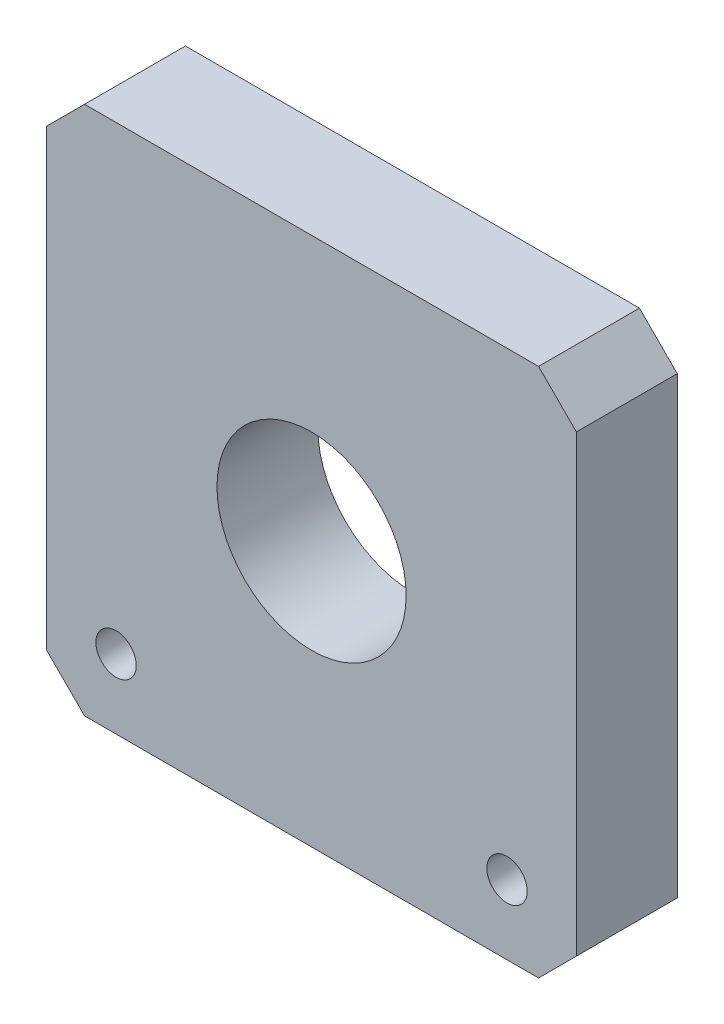
ISO-10303-21;
HEADER;
FILE_DESCRIPTION(('STEP AP214'),'2;1');
FILE_NAME('part.step','',(''),(''),'','','');
FILE_SCHEMA(('AUTOMOTIVE_DESIGN { 1 0 10303 214 1 1 1 1 }'));
ENDSEC;
DATA;
#1=APPLICATION_CONTEXT('core data for automotive mechanical design processes');
#2=APPLICATION_PROTOCOL_DEFINITION('international standard','automotive_design',2000,#1);
#3=PRODUCT_CONTEXT('',#1,'mechanical');
#4=PRODUCT('Part','Part','',(#3));
#5=PRODUCT_RELATED_PRODUCT_CATEGORY('part','',(#4));
#6=PRODUCT_DEFINITION_FORMATION('','',#4);
#7=PRODUCT_DEFINITION_CONTEXT('part definition',#1,'design');
#8=PRODUCT_DEFINITION('design','',#6,#7);
#9=PRODUCT_DEFINITION_SHAPE('','',#8);
#10=(LENGTH_UNIT() NAMED_UNIT(*) SI_UNIT(.MILLI.,.METRE.));
#11=(NAMED_UNIT(*) PLANE_ANGLE_UNIT() SI_UNIT($,.RADIAN.));
#12=(NAMED_UNIT(*) SI_UNIT($,.STERADIAN.) SOLID_ANGLE_UNIT());
#13=UNCERTAINTY_MEASURE_WITH_UNIT(LENGTH_MEASURE(1.E-05),#10,'distance_accuracy_value','');
#14=(GEOMETRIC_REPRESENTATION_CONTEXT(3) GLOBAL_UNCERTAINTY_ASSIGNED_CONTEXT((#13)) GLOBAL_UNIT_ASSIGNED_CONTEXT((#10,
#11,#12)) REPRESENTATION_CONTEXT('',''));
#15=CARTESIAN_POINT('',(0.,0.,0.));
#16=DIRECTION('',(0.,0.,1.));
#17=DIRECTION('',(1.,0.,0.));
#18=AXIS2_PLACEMENT_3D('',#15,#16,#17);
#19=CARTESIAN_POINT('',(0.,0.,8.));
#20=DIRECTION('',(1.,0.,0.));
#21=DIRECTION('',(0.,0.,-1.));
#22=AXIS2_PLACEMENT_3D('',#19,#20,#21);
#23=PLANE('',#22);
#24=DIRECTION('',(0.,-1.,0.));
#25=VECTOR('',#24,1.);
#26=CARTESIAN_POINT('',(0.,0.,0.));
#27=LINE('',#26,#25);
#28=CARTESIAN_POINT('',(0.,39.,0.));
#29=VERTEX_POINT('',#28);
#30=CARTESIAN_POINT('',(0.,3.00000000000002,0.));
#31=VERTEX_POINT('',#30);
#32=EDGE_CURVE('E133',#29,#31,#27,.T.);
#33=ORIENTED_EDGE('',*,*,#32,.T.);
#34=DIRECTION('',(0.,0.,1.));
#35=VECTOR('',#34,1.);
#36=CARTESIAN_POINT('',(0.,3.00000000000002,8.));
#37=LINE('',#36,#35);
#38=CARTESIAN_POINT('',(0.,3.00000000000002,8.));
#39=VERTEX_POINT('',#38);
#40=EDGE_CURVE('E165',#31,#39,#37,.T.);
#41=ORIENTED_EDGE('',*,*,#40,.T.);
#42=DIRECTION('',(0.,-1.,0.));
#43=VECTOR('',#42,1.);
#44=CARTESIAN_POINT('',(0.,0.,8.));
#45=LINE('',#44,#43);
#46=CARTESIAN_POINT('',(0.,39.,8.));
#47=VERTEX_POINT('',#46);
#48=EDGE_CURVE('E131',#47,#39,#45,.T.);
#49=ORIENTED_EDGE('',*,*,#48,.F.);
#50=DIRECTION('',(0.,0.,-1.));
#51=VECTOR('',#50,1.);
#52=CARTESIAN_POINT('',(0.,39.,8.));
#53=LINE('',#52,#51);
#54=EDGE_CURVE('E162',#47,#29,#53,.T.);
#55=ORIENTED_EDGE('',*,*,#54,.T.);
#56=EDGE_LOOP('',(#33,#41,#49,#55));
#57=FACE_BOUND('',#56,.T.);
#58=ADVANCED_FACE('F36',(#57),#23,.F.);
#59=CARTESIAN_POINT('',(0.,0.,8.));
#60=DIRECTION('',(0.,1.,0.));
#61=DIRECTION('',(0.,0.,1.));
#62=AXIS2_PLACEMENT_3D('',#59,#60,#61);
#63=PLANE('',#62);
#64=DIRECTION('',(1.,0.,0.));
#65=VECTOR('',#64,1.);
#66=CARTESIAN_POINT('',(0.,0.,0.));
#67=LINE('',#66,#65);
#68=CARTESIAN_POINT('',(3.,0.,0.));
#69=VERTEX_POINT('',#68);
#70=CARTESIAN_POINT('',(39.,0.,0.));
#71=VERTEX_POINT('',#70);
#72=EDGE_CURVE('E129',#69,#71,#67,.T.);
#73=ORIENTED_EDGE('',*,*,#72,.T.);
#74=DIRECTION('',(0.,0.,1.));
#75=VECTOR('',#74,1.);
#76=CARTESIAN_POINT('',(39.,0.,8.));
#77=LINE('',#76,#75);
#78=CARTESIAN_POINT('',(39.,0.,8.));
#79=VERTEX_POINT('',#78);
#80=EDGE_CURVE('E107',#71,#79,#77,.T.);
#81=ORIENTED_EDGE('',*,*,#80,.T.);
#82=DIRECTION('',(1.,0.,0.));
#83=VECTOR('',#82,1.);
#84=CARTESIAN_POINT('',(0.,0.,8.));
#85=LINE('',#84,#83);
#86=CARTESIAN_POINT('',(3.,0.,8.));
#87=VERTEX_POINT('',#86);
#88=EDGE_CURVE('E179',#87,#79,#85,.T.);
#89=ORIENTED_EDGE('',*,*,#88,.F.);
#90=DIRECTION('',(0.,0.,-1.));
#91=VECTOR('',#90,1.);
#92=CARTESIAN_POINT('',(3.,0.,8.));
#93=LINE('',#92,#91);
#94=EDGE_CURVE('E112',#87,#69,#93,.T.);
#95=ORIENTED_EDGE('',*,*,#94,.T.);
#96=EDGE_LOOP('',(#73,#81,#89,#95));
#97=FACE_BOUND('',#96,.T.);
#98=ADVANCED_FACE('F184',(#97),#63,.F.);
#99=CARTESIAN_POINT('',(42.,0.,8.));
#100=DIRECTION('',(-1.,0.,0.));
#101=DIRECTION('',(0.,0.,1.));
#102=AXIS2_PLACEMENT_3D('',#99,#100,#101);
#103=PLANE('',#102);
#104=DIRECTION('',(0.,1.,0.));
#105=VECTOR('',#104,1.);
#106=CARTESIAN_POINT('',(42.,0.,8.));
#107=LINE('',#106,#105);
#108=CARTESIAN_POINT('',(42.,3.,8.));
#109=VERTEX_POINT('',#108);
#110=CARTESIAN_POINT('',(42.,39.,8.));
#111=VERTEX_POINT('',#110);
#112=EDGE_CURVE('E121',#109,#111,#107,.T.);
#113=ORIENTED_EDGE('',*,*,#112,.F.);
#114=DIRECTION('',(0.,0.,-1.));
#115=VECTOR('',#114,1.);
#116=CARTESIAN_POINT('',(42.,3.,8.));
#117=LINE('',#116,#115);
#118=CARTESIAN_POINT('',(42.,3.,0.));
#119=VERTEX_POINT('',#118);
#120=EDGE_CURVE('E106',#109,#119,#117,.T.);
#121=ORIENTED_EDGE('',*,*,#120,.T.);
#122=DIRECTION('',(0.,1.,0.));
#123=VECTOR('',#122,1.);
#124=CARTESIAN_POINT('',(42.,0.,0.));
#125=LINE('',#124,#123);
#126=CARTESIAN_POINT('',(42.,39.,0.));
#127=VERTEX_POINT('',#126);
#128=EDGE_CURVE('E119',#119,#127,#125,.T.);
#129=ORIENTED_EDGE('',*,*,#128,.T.);
#130=DIRECTION('',(0.,0.,1.));
#131=VECTOR('',#130,1.);
#132=CARTESIAN_POINT('',(42.,39.,8.));
#133=LINE('',#132,#131);
#134=EDGE_CURVE('E123',#127,#111,#133,.T.);
#135=ORIENTED_EDGE('',*,*,#134,.T.);
#136=EDGE_LOOP('',(#113,#121,#129,#135));
#137=FACE_BOUND('',#136,.T.);
#138=ADVANCED_FACE('F118',(#137),#103,.F.);
#139=CARTESIAN_POINT('',(0.,42.,8.));
#140=DIRECTION('',(0.,-1.,0.));
#141=DIRECTION('',(0.,0.,-1.));
#142=AXIS2_PLACEMENT_3D('',#139,#140,#141);
#143=PLANE('',#142);
#144=DIRECTION('',(-1.,0.,0.));
#145=VECTOR('',#144,1.);
#146=CARTESIAN_POINT('',(0.,42.,8.));
#147=LINE('',#146,#145);
#148=CARTESIAN_POINT('',(39.,42.,8.));
#149=VERTEX_POINT('',#148);
#150=CARTESIAN_POINT('',(3.00000000000002,42.,8.));
#151=VERTEX_POINT('',#150);
#152=EDGE_CURVE('E147',#149,#151,#147,.T.);
#153=ORIENTED_EDGE('',*,*,#152,.F.);
#154=DIRECTION('',(0.,0.,-1.));
#155=VECTOR('',#154,1.);
#156=CARTESIAN_POINT('',(39.,42.,8.));
#157=LINE('',#156,#155);
#158=CARTESIAN_POINT('',(39.,42.,0.));
#159=VERTEX_POINT('',#158);
#160=EDGE_CURVE('E11',#149,#159,#157,.T.);
#161=ORIENTED_EDGE('',*,*,#160,.T.);
#162=DIRECTION('',(-1.,0.,0.));
#163=VECTOR('',#162,1.);
#164=CARTESIAN_POINT('',(0.,42.,0.));
#165=LINE('',#164,#163);
#166=CARTESIAN_POINT('',(3.00000000000002,42.,0.));
#167=VERTEX_POINT('',#166);
#168=EDGE_CURVE('E128',#159,#167,#165,.T.);
#169=ORIENTED_EDGE('',*,*,#168,.T.);
#170=DIRECTION('',(0.,0.,1.));
#171=VECTOR('',#170,1.);
#172=CARTESIAN_POINT('',(3.00000000000002,42.,8.));
#173=LINE('',#172,#171);
#174=EDGE_CURVE('E44',#167,#151,#173,.T.);
#175=ORIENTED_EDGE('',*,*,#174,.T.);
#176=EDGE_LOOP('',(#153,#161,#169,#175));
#177=FACE_BOUND('',#176,.T.);
#178=ADVANCED_FACE('F202',(#177),#143,.F.);
#179=CARTESIAN_POINT('',(0.,0.,8.));
#180=DIRECTION('',(0.,0.,-1.));
#181=DIRECTION('',(-1.,0.,0.));
#182=AXIS2_PLACEMENT_3D('',#179,#180,#181);
#183=PLANE('',#182);
#184=CARTESIAN_POINT('',(36.5,5.5,8.));
#185=DIRECTION('',(0.,0.,1.));
#186=DIRECTION('',(1.,0.,0.));
#187=AXIS2_PLACEMENT_3D('',#184,#185,#186);
#188=CIRCLE('',#187,1.6);
#189=CARTESIAN_POINT('',(38.1,5.5,8.));
#190=VERTEX_POINT('',#189);
#191=EDGE_CURVE('E141',#190,#190,#188,.T.);
#192=ORIENTED_EDGE('',*,*,#191,.F.);
#193=EDGE_LOOP('',(#192));
#194=FACE_BOUND('',#193,.T.);
#195=CARTESIAN_POINT('',(5.50000000000001,5.5,8.));
#196=DIRECTION('',(0.,0.,1.));
#197=DIRECTION('',(1.,0.,0.));
#198=AXIS2_PLACEMENT_3D('',#195,#196,#197);
#199=CIRCLE('',#198,1.6);
#200=CARTESIAN_POINT('',(7.1,5.5,8.));
#201=VERTEX_POINT('',#200);
#202=EDGE_CURVE('E192',#201,#201,#199,.T.);
#203=ORIENTED_EDGE('',*,*,#202,.F.);
#204=EDGE_LOOP('',(#203));
#205=FACE_BOUND('',#204,.T.);
#206=CARTESIAN_POINT('',(21.,21.,8.));
#207=DIRECTION('',(0.,0.,1.));
#208=DIRECTION('',(1.,0.,0.));
#209=AXIS2_PLACEMENT_3D('',#206,#207,#208);
#210=CIRCLE('',#209,7.5);
#211=CARTESIAN_POINT('',(28.5,21.,8.));
#212=VERTEX_POINT('',#211);
#213=EDGE_CURVE('E189',#212,#212,#210,.T.);
#214=ORIENTED_EDGE('',*,*,#213,.F.);
#215=EDGE_LOOP('',(#214));
#216=FACE_BOUND('',#215,.T.);
#217=ORIENTED_EDGE('',*,*,#88,.T.);
#218=DIRECTION('',(-0.707106781186549,-0.707106781186546,0.));
#219=VECTOR('',#218,1.);
#220=CARTESIAN_POINT('',(42.,3.,8.));
#221=LINE('',#220,#219);
#222=EDGE_CURVE('E160',#79,#109,#221,.F.);
#223=ORIENTED_EDGE('',*,*,#222,.T.);
#224=ORIENTED_EDGE('',*,*,#112,.T.);
#225=DIRECTION('',(0.707106781186546,-0.707106781186549,0.));
#226=VECTOR('',#225,1.);
#227=CARTESIAN_POINT('',(39.,42.,8.));
#228=LINE('',#227,#226);
#229=EDGE_CURVE('E57',#111,#149,#228,.F.);
#230=ORIENTED_EDGE('',*,*,#229,.T.);
#231=ORIENTED_EDGE('',*,*,#152,.T.);
#232=DIRECTION('',(0.707106781186549,0.707106781186546,0.));
#233=VECTOR('',#232,1.);
#234=CARTESIAN_POINT('',(0.,39.,8.));
#235=LINE('',#234,#233);
#236=EDGE_CURVE('E155',#151,#47,#235,.F.);
#237=ORIENTED_EDGE('',*,*,#236,.T.);
#238=ORIENTED_EDGE('',*,*,#48,.T.);
#239=DIRECTION('',(-0.707106781186546,0.707106781186549,0.));
#240=VECTOR('',#239,1.);
#241=CARTESIAN_POINT('',(3.,0.,8.));
#242=LINE('',#241,#240);
#243=EDGE_CURVE('E158',#39,#87,#242,.F.);
#244=ORIENTED_EDGE('',*,*,#243,.T.);
#245=EDGE_LOOP('',(#217,#223,#224,#230,#231,#237,#238,#244));
#246=FACE_BOUND('',#245,.T.);
#247=ADVANCED_FACE('F176',(#194,#205,#216,#246),#183,.F.);
#248=CARTESIAN_POINT('',(0.,0.,0.));
#249=DIRECTION('',(0.,0.,-1.));
#250=DIRECTION('',(-1.,0.,0.));
#251=AXIS2_PLACEMENT_3D('',#248,#249,#250);
#252=PLANE('',#251);
#253=CARTESIAN_POINT('',(36.5,5.5,0.));
#254=DIRECTION('',(0.,0.,-1.));
#255=DIRECTION('',(-1.,0.,0.));
#256=AXIS2_PLACEMENT_3D('',#253,#254,#255);
#257=CIRCLE('',#256,1.6);
#258=CARTESIAN_POINT('',(34.9,5.5,0.));
#259=VERTEX_POINT('',#258);
#260=EDGE_CURVE('E144',#259,#259,#257,.T.);
#261=ORIENTED_EDGE('',*,*,#260,.F.);
#262=EDGE_LOOP('',(#261));
#263=FACE_BOUND('',#262,.T.);
#264=CARTESIAN_POINT('',(5.50000000000001,5.5,0.));
#265=DIRECTION('',(0.,0.,-1.));
#266=DIRECTION('',(-1.,0.,0.));
#267=AXIS2_PLACEMENT_3D('',#264,#265,#266);
#268=CIRCLE('',#267,1.6);
#269=CARTESIAN_POINT('',(3.90000000000001,5.5,0.));
#270=VERTEX_POINT('',#269);
#271=EDGE_CURVE('E140',#270,#270,#268,.T.);
#272=ORIENTED_EDGE('',*,*,#271,.F.);
#273=EDGE_LOOP('',(#272));
#274=FACE_BOUND('',#273,.T.);
#275=CARTESIAN_POINT('',(21.,21.,0.));
#276=DIRECTION('',(0.,0.,-1.));
#277=DIRECTION('',(-1.,0.,0.));
#278=AXIS2_PLACEMENT_3D('',#275,#276,#277);
#279=CIRCLE('',#278,7.5);
#280=CARTESIAN_POINT('',(13.5,21.,0.));
#281=VERTEX_POINT('',#280);
#282=EDGE_CURVE('E137',#281,#281,#279,.T.);
#283=ORIENTED_EDGE('',*,*,#282,.F.);
#284=EDGE_LOOP('',(#283));
#285=FACE_BOUND('',#284,.T.);
#286=ORIENTED_EDGE('',*,*,#128,.F.);
#287=DIRECTION('',(0.707106781186549,0.707106781186546,0.));
#288=VECTOR('',#287,1.);
#289=CARTESIAN_POINT('',(19.4999999999999,-19.5,0.));
#290=LINE('',#289,#288);
#291=EDGE_CURVE('E102',#119,#71,#290,.F.);
#292=ORIENTED_EDGE('',*,*,#291,.T.);
#293=ORIENTED_EDGE('',*,*,#72,.F.);
#294=DIRECTION('',(0.707106781186546,-0.707106781186549,0.));
#295=VECTOR('',#294,1.);
#296=CARTESIAN_POINT('',(1.50000000000001,1.5,0.));
#297=LINE('',#296,#295);
#298=EDGE_CURVE('E113',#69,#31,#297,.F.);
#299=ORIENTED_EDGE('',*,*,#298,.T.);
#300=ORIENTED_EDGE('',*,*,#32,.F.);
#301=DIRECTION('',(-0.707106781186549,-0.707106781186546,0.));
#302=VECTOR('',#301,1.);
#303=CARTESIAN_POINT('',(-19.5,19.5000000000001,0.));
#304=LINE('',#303,#302);
#305=EDGE_CURVE('E122',#29,#167,#304,.F.);
#306=ORIENTED_EDGE('',*,*,#305,.T.);
#307=ORIENTED_EDGE('',*,*,#168,.F.);
#308=DIRECTION('',(-0.707106781186546,0.707106781186549,0.));
#309=VECTOR('',#308,1.);
#310=CARTESIAN_POINT('',(40.5000000000001,40.4999999999999,0.));
#311=LINE('',#310,#309);
#312=EDGE_CURVE('E127',#159,#127,#311,.F.);
#313=ORIENTED_EDGE('',*,*,#312,.T.);
#314=EDGE_LOOP('',(#286,#292,#293,#299,#300,#306,#307,#313));
#315=FACE_BOUND('',#314,.T.);
#316=ADVANCED_FACE('F125',(#263,#274,#285,#315),#252,.T.);
#317=CARTESIAN_POINT('',(21.,21.,-0.999999999999999));
#318=DIRECTION('',(0.,0.,1.));
#319=DIRECTION('',(1.,0.,0.));
#320=AXIS2_PLACEMENT_3D('',#317,#318,#319);
#321=CYLINDRICAL_SURFACE('',#320,7.5);
#322=ORIENTED_EDGE('',*,*,#282,.T.);
#323=EDGE_LOOP('',(#322));
#324=FACE_BOUND('',#323,.T.);
#325=ORIENTED_EDGE('',*,*,#213,.T.);
#326=EDGE_LOOP('',(#325));
#327=FACE_BOUND('',#326,.T.);
#328=ADVANCED_FACE('F208',(#324,#327),#321,.F.);
#329=CARTESIAN_POINT('',(5.50000000000001,5.5,-0.999999999999999));
#330=DIRECTION('',(0.,0.,1.));
#331=DIRECTION('',(1.,0.,0.));
#332=AXIS2_PLACEMENT_3D('',#329,#330,#331);
#333=CYLINDRICAL_SURFACE('',#332,1.6);
#334=ORIENTED_EDGE('',*,*,#271,.T.);
#335=EDGE_LOOP('',(#334));
#336=FACE_BOUND('',#335,.T.);
#337=ORIENTED_EDGE('',*,*,#202,.T.);
#338=EDGE_LOOP('',(#337));
#339=FACE_BOUND('',#338,.T.);
#340=ADVANCED_FACE('F210',(#336,#339),#333,.F.);
#341=CARTESIAN_POINT('',(36.5,5.5,-0.999999999999999));
#342=DIRECTION('',(0.,0.,1.));
#343=DIRECTION('',(1.,0.,0.));
#344=AXIS2_PLACEMENT_3D('',#341,#342,#343);
#345=CYLINDRICAL_SURFACE('',#344,1.6);
#346=ORIENTED_EDGE('',*,*,#260,.T.);
#347=EDGE_LOOP('',(#346));
#348=FACE_BOUND('',#347,.T.);
#349=ORIENTED_EDGE('',*,*,#191,.T.);
#350=EDGE_LOOP('',(#349));
#351=FACE_BOUND('',#350,.T.);
#352=ADVANCED_FACE('F198',(#348,#351),#345,.F.);
#353=CARTESIAN_POINT('',(42.,3.,8.));
#354=DIRECTION('',(-0.707106781186546,0.707106781186549,0.));
#355=DIRECTION('',(0.,0.,-1.));
#356=AXIS2_PLACEMENT_3D('',#353,#354,#355);
#357=PLANE('',#356);
#358=ORIENTED_EDGE('',*,*,#222,.F.);
#359=ORIENTED_EDGE('',*,*,#80,.F.);
#360=ORIENTED_EDGE('',*,*,#291,.F.);
#361=ORIENTED_EDGE('',*,*,#120,.F.);
#362=EDGE_LOOP('',(#358,#359,#360,#361));
#363=FACE_BOUND('',#362,.T.);
#364=ADVANCED_FACE('F105',(#363),#357,.F.);
#365=CARTESIAN_POINT('',(3.,0.,8.));
#366=DIRECTION('',(0.707106781186549,0.707106781186546,0.));
#367=DIRECTION('',(0.,0.,-1.));
#368=AXIS2_PLACEMENT_3D('',#365,#366,#367);
#369=PLANE('',#368);
#370=ORIENTED_EDGE('',*,*,#243,.F.);
#371=ORIENTED_EDGE('',*,*,#40,.F.);
#372=ORIENTED_EDGE('',*,*,#298,.F.);
#373=ORIENTED_EDGE('',*,*,#94,.F.);
#374=EDGE_LOOP('',(#370,#371,#372,#373));
#375=FACE_BOUND('',#374,.T.);
#376=ADVANCED_FACE('F182',(#375),#369,.F.);
#377=CARTESIAN_POINT('',(39.,42.,8.));
#378=DIRECTION('',(-0.707106781186549,-0.707106781186546,0.));
#379=DIRECTION('',(0.,0.,-1.));
#380=AXIS2_PLACEMENT_3D('',#377,#378,#379);
#381=PLANE('',#380);
#382=ORIENTED_EDGE('',*,*,#229,.F.);
#383=ORIENTED_EDGE('',*,*,#134,.F.);
#384=ORIENTED_EDGE('',*,*,#312,.F.);
#385=ORIENTED_EDGE('',*,*,#160,.F.);
#386=EDGE_LOOP('',(#382,#383,#384,#385));
#387=FACE_BOUND('',#386,.T.);
#388=ADVANCED_FACE('F232',(#387),#381,.F.);
#389=CARTESIAN_POINT('',(0.,39.,8.));
#390=DIRECTION('',(0.707106781186546,-0.707106781186549,0.));
#391=DIRECTION('',(0.,0.,-1.));
#392=AXIS2_PLACEMENT_3D('',#389,#390,#391);
#393=PLANE('',#392);
#394=ORIENTED_EDGE('',*,*,#236,.F.);
#395=ORIENTED_EDGE('',*,*,#174,.F.);
#396=ORIENTED_EDGE('',*,*,#305,.F.);
#397=ORIENTED_EDGE('',*,*,#54,.F.);
#398=EDGE_LOOP('',(#394,#395,#396,#397));
#399=FACE_BOUND('',#398,.T.);
#400=ADVANCED_FACE('F38',(#399),#393,.F.);
#401=CLOSED_SHELL('',(#58,#98,#138,#178,#247,#316,#328,#340,#352,#364,#376,#388,#400));
#402=MANIFOLD_SOLID_BREP('B2',#401);
#403=ADVANCED_BREP_SHAPE_REPRESENTATION('',(#18,#402),#14);
#404=SHAPE_DEFINITION_REPRESENTATION(#9,#403);
ENDSEC;
END-ISO-10303-21;
